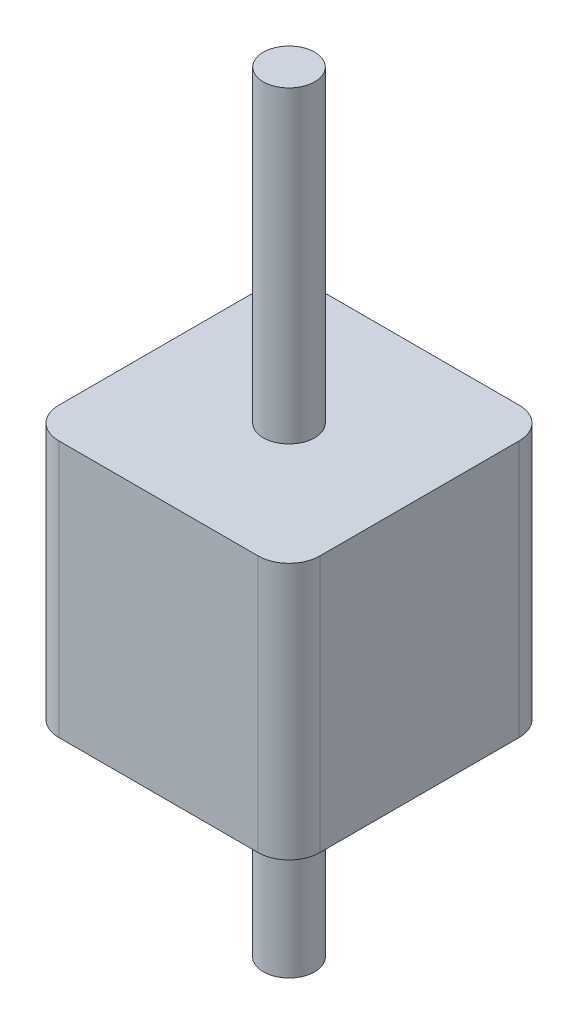
ISO-10303-21;
HEADER;
FILE_DESCRIPTION(('STEP AP214'),'2;1');
FILE_NAME('part.step','',(''),(''),'','','');
FILE_SCHEMA(('AUTOMOTIVE_DESIGN { 1 0 10303 214 1 1 1 1 }'));
ENDSEC;
DATA;
#1=APPLICATION_CONTEXT('core data for automotive mechanical design processes');
#2=APPLICATION_PROTOCOL_DEFINITION('international standard','automotive_design',2000,#1);
#3=PRODUCT_CONTEXT('',#1,'mechanical');
#4=PRODUCT('Part','Part','',(#3));
#5=PRODUCT_RELATED_PRODUCT_CATEGORY('part','',(#4));
#6=PRODUCT_DEFINITION_FORMATION('','',#4);
#7=PRODUCT_DEFINITION_CONTEXT('part definition',#1,'design');
#8=PRODUCT_DEFINITION('design','',#6,#7);
#9=PRODUCT_DEFINITION_SHAPE('','',#8);
#10=(LENGTH_UNIT() NAMED_UNIT(*) SI_UNIT(.MILLI.,.METRE.));
#11=(NAMED_UNIT(*) PLANE_ANGLE_UNIT() SI_UNIT($,.RADIAN.));
#12=(NAMED_UNIT(*) SI_UNIT($,.STERADIAN.) SOLID_ANGLE_UNIT());
#13=UNCERTAINTY_MEASURE_WITH_UNIT(LENGTH_MEASURE(1.E-05),#10,'distance_accuracy_value','');
#14=(GEOMETRIC_REPRESENTATION_CONTEXT(3) GLOBAL_UNCERTAINTY_ASSIGNED_CONTEXT((#13)) GLOBAL_UNIT_ASSIGNED_CONTEXT((#10,
#11,#12)) REPRESENTATION_CONTEXT('',''));
#15=CARTESIAN_POINT('',(0.,0.,0.));
#16=DIRECTION('',(0.,0.,1.));
#17=DIRECTION('',(1.,0.,0.));
#18=AXIS2_PLACEMENT_3D('',#15,#16,#17);
#19=CARTESIAN_POINT('',(0.97,2.5,0.97));
#20=DIRECTION('',(0.,-1.,0.));
#21=DIRECTION('',(0.,0.,-1.));
#22=AXIS2_PLACEMENT_3D('',#19,#20,#21);
#23=CYLINDRICAL_SURFACE('',#22,0.3);
#24=CARTESIAN_POINT('',(0.97,0.,0.97));
#25=DIRECTION('',(0.,1.,0.));
#26=DIRECTION('',(0.,0.,1.));
#27=AXIS2_PLACEMENT_3D('',#24,#25,#26);
#28=CIRCLE('',#27,0.3);
#29=CARTESIAN_POINT('',(0.969999999999998,0.,1.27));
#30=VERTEX_POINT('',#29);
#31=CARTESIAN_POINT('',(1.27,0.,0.969999999999998));
#32=VERTEX_POINT('',#31);
#33=EDGE_CURVE('E147',#30,#32,#28,.T.);
#34=ORIENTED_EDGE('',*,*,#33,.T.);
#35=DIRECTION('',(0.,-1.,0.));
#36=VECTOR('',#35,1.);
#37=CARTESIAN_POINT('',(1.27,2.5,0.969999999999998));
#38=LINE('',#37,#36);
#39=CARTESIAN_POINT('',(1.27,2.5,0.969999999999998));
#40=VERTEX_POINT('',#39);
#41=EDGE_CURVE('E54',#40,#32,#38,.T.);
#42=ORIENTED_EDGE('',*,*,#41,.F.);
#43=CARTESIAN_POINT('',(0.97,2.5,0.97));
#44=DIRECTION('',(0.,1.,0.));
#45=DIRECTION('',(0.,0.,1.));
#46=AXIS2_PLACEMENT_3D('',#43,#44,#45);
#47=CIRCLE('',#46,0.3);
#48=CARTESIAN_POINT('',(0.969999999999998,2.5,1.27));
#49=VERTEX_POINT('',#48);
#50=EDGE_CURVE('E170',#49,#40,#47,.T.);
#51=ORIENTED_EDGE('',*,*,#50,.F.);
#52=DIRECTION('',(0.,-1.,0.));
#53=VECTOR('',#52,1.);
#54=CARTESIAN_POINT('',(0.969999999999998,2.5,1.27));
#55=LINE('',#54,#53);
#56=EDGE_CURVE('E143',#49,#30,#55,.T.);
#57=ORIENTED_EDGE('',*,*,#56,.T.);
#58=EDGE_LOOP('',(#34,#42,#51,#57));
#59=FACE_BOUND('',#58,.T.);
#60=ADVANCED_FACE('F45',(#59),#23,.T.);
#61=CARTESIAN_POINT('',(1.27,2.5,0.969999999999998));
#62=DIRECTION('',(-1.,0.,0.));
#63=DIRECTION('',(0.,0.,1.));
#64=AXIS2_PLACEMENT_3D('',#61,#62,#63);
#65=PLANE('',#64);
#66=DIRECTION('',(0.,0.,-1.));
#67=VECTOR('',#66,1.);
#68=CARTESIAN_POINT('',(1.27,0.,0.969999999999998));
#69=LINE('',#68,#67);
#70=CARTESIAN_POINT('',(1.27,0.,-0.969999999999998));
#71=VERTEX_POINT('',#70);
#72=EDGE_CURVE('E151',#32,#71,#69,.T.);
#73=ORIENTED_EDGE('',*,*,#72,.T.);
#74=DIRECTION('',(0.,-1.,0.));
#75=VECTOR('',#74,1.);
#76=CARTESIAN_POINT('',(1.27,2.5,-0.969999999999998));
#77=LINE('',#76,#75);
#78=CARTESIAN_POINT('',(1.27,2.5,-0.969999999999998));
#79=VERTEX_POINT('',#78);
#80=EDGE_CURVE('E185',#79,#71,#77,.T.);
#81=ORIENTED_EDGE('',*,*,#80,.F.);
#82=DIRECTION('',(0.,0.,-1.));
#83=VECTOR('',#82,1.);
#84=CARTESIAN_POINT('',(1.27,2.5,0.969999999999998));
#85=LINE('',#84,#83);
#86=EDGE_CURVE('E106',#40,#79,#85,.T.);
#87=ORIENTED_EDGE('',*,*,#86,.F.);
#88=ORIENTED_EDGE('',*,*,#41,.T.);
#89=EDGE_LOOP('',(#73,#81,#87,#88));
#90=FACE_BOUND('',#89,.T.);
#91=ADVANCED_FACE('F190',(#90),#65,.F.);
#92=CARTESIAN_POINT('',(0.97,2.5,-0.97));
#93=DIRECTION('',(0.,-1.,0.));
#94=DIRECTION('',(0.,0.,-1.));
#95=AXIS2_PLACEMENT_3D('',#92,#93,#94);
#96=CYLINDRICAL_SURFACE('',#95,0.3);
#97=CARTESIAN_POINT('',(0.97,0.,-0.97));
#98=DIRECTION('',(0.,1.,0.));
#99=DIRECTION('',(0.,0.,-1.));
#100=AXIS2_PLACEMENT_3D('',#97,#98,#99);
#101=CIRCLE('',#100,0.3);
#102=CARTESIAN_POINT('',(0.969999999999998,0.,-1.27));
#103=VERTEX_POINT('',#102);
#104=EDGE_CURVE('E155',#71,#103,#101,.T.);
#105=ORIENTED_EDGE('',*,*,#104,.T.);
#106=DIRECTION('',(0.,-1.,0.));
#107=VECTOR('',#106,1.);
#108=CARTESIAN_POINT('',(0.969999999999998,2.5,-1.27));
#109=LINE('',#108,#107);
#110=CARTESIAN_POINT('',(0.969999999999998,2.5,-1.27));
#111=VERTEX_POINT('',#110);
#112=EDGE_CURVE('E181',#111,#103,#109,.T.);
#113=ORIENTED_EDGE('',*,*,#112,.F.);
#114=CARTESIAN_POINT('',(0.97,2.5,-0.97));
#115=DIRECTION('',(0.,1.,0.));
#116=DIRECTION('',(0.,0.,-1.));
#117=AXIS2_PLACEMENT_3D('',#114,#115,#116);
#118=CIRCLE('',#117,0.3);
#119=EDGE_CURVE('E209',#79,#111,#118,.T.);
#120=ORIENTED_EDGE('',*,*,#119,.F.);
#121=ORIENTED_EDGE('',*,*,#80,.T.);
#122=EDGE_LOOP('',(#105,#113,#120,#121));
#123=FACE_BOUND('',#122,.T.);
#124=ADVANCED_FACE('F201',(#123),#96,.T.);
#125=CARTESIAN_POINT('',(-0.969999999999998,2.5,-1.27));
#126=DIRECTION('',(0.,0.,1.));
#127=DIRECTION('',(1.,0.,0.));
#128=AXIS2_PLACEMENT_3D('',#125,#126,#127);
#129=PLANE('',#128);
#130=DIRECTION('',(-1.,0.,0.));
#131=VECTOR('',#130,1.);
#132=CARTESIAN_POINT('',(-0.969999999999998,0.,-1.27));
#133=LINE('',#132,#131);
#134=CARTESIAN_POINT('',(-0.97,0.,-1.27));
#135=VERTEX_POINT('',#134);
#136=EDGE_CURVE('E158',#103,#135,#133,.T.);
#137=ORIENTED_EDGE('',*,*,#136,.T.);
#138=DIRECTION('',(0.,-1.,0.));
#139=VECTOR('',#138,1.);
#140=CARTESIAN_POINT('',(-0.97,2.5,-1.27));
#141=LINE('',#140,#139);
#142=CARTESIAN_POINT('',(-0.97,2.5,-1.27));
#143=VERTEX_POINT('',#142);
#144=EDGE_CURVE('E177',#143,#135,#141,.T.);
#145=ORIENTED_EDGE('',*,*,#144,.F.);
#146=DIRECTION('',(-1.,0.,0.));
#147=VECTOR('',#146,1.);
#148=CARTESIAN_POINT('',(-0.969999999999998,2.5,-1.27));
#149=LINE('',#148,#147);
#150=EDGE_CURVE('E207',#111,#143,#149,.T.);
#151=ORIENTED_EDGE('',*,*,#150,.F.);
#152=ORIENTED_EDGE('',*,*,#112,.T.);
#153=EDGE_LOOP('',(#137,#145,#151,#152));
#154=FACE_BOUND('',#153,.T.);
#155=ADVANCED_FACE('F205',(#154),#129,.F.);
#156=CARTESIAN_POINT('',(-0.97,2.5,-0.97));
#157=DIRECTION('',(0.,-1.,0.));
#158=DIRECTION('',(0.,0.,-1.));
#159=AXIS2_PLACEMENT_3D('',#156,#157,#158);
#160=CYLINDRICAL_SURFACE('',#159,0.3);
#161=CARTESIAN_POINT('',(-0.97,0.,-0.97));
#162=DIRECTION('',(0.,1.,0.));
#163=DIRECTION('',(0.,0.,-1.));
#164=AXIS2_PLACEMENT_3D('',#161,#162,#163);
#165=CIRCLE('',#164,0.3);
#166=CARTESIAN_POINT('',(-1.27,0.,-0.969999999999998));
#167=VERTEX_POINT('',#166);
#168=EDGE_CURVE('E161',#135,#167,#165,.T.);
#169=ORIENTED_EDGE('',*,*,#168,.T.);
#170=DIRECTION('',(0.,-1.,0.));
#171=VECTOR('',#170,1.);
#172=CARTESIAN_POINT('',(-1.27,2.5,-0.969999999999998));
#173=LINE('',#172,#171);
#174=CARTESIAN_POINT('',(-1.27,2.5,-0.969999999999998));
#175=VERTEX_POINT('',#174);
#176=EDGE_CURVE('E136',#175,#167,#173,.T.);
#177=ORIENTED_EDGE('',*,*,#176,.F.);
#178=CARTESIAN_POINT('',(-0.97,2.5,-0.97));
#179=DIRECTION('',(0.,1.,0.));
#180=DIRECTION('',(0.,0.,-1.));
#181=AXIS2_PLACEMENT_3D('',#178,#179,#180);
#182=CIRCLE('',#181,0.3);
#183=EDGE_CURVE('E125',#143,#175,#182,.T.);
#184=ORIENTED_EDGE('',*,*,#183,.F.);
#185=ORIENTED_EDGE('',*,*,#144,.T.);
#186=EDGE_LOOP('',(#169,#177,#184,#185));
#187=FACE_BOUND('',#186,.T.);
#188=ADVANCED_FACE('F264',(#187),#160,.T.);
#189=CARTESIAN_POINT('',(-1.27,2.5,0.969999999999998));
#190=DIRECTION('',(1.,0.,0.));
#191=DIRECTION('',(0.,0.,-1.));
#192=AXIS2_PLACEMENT_3D('',#189,#190,#191);
#193=PLANE('',#192);
#194=DIRECTION('',(0.,0.,1.));
#195=VECTOR('',#194,1.);
#196=CARTESIAN_POINT('',(-1.27,0.,0.969999999999998));
#197=LINE('',#196,#195);
#198=CARTESIAN_POINT('',(-1.27,0.,0.969999999999998));
#199=VERTEX_POINT('',#198);
#200=EDGE_CURVE('E134',#167,#199,#197,.T.);
#201=ORIENTED_EDGE('',*,*,#200,.T.);
#202=DIRECTION('',(0.,-1.,0.));
#203=VECTOR('',#202,1.);
#204=CARTESIAN_POINT('',(-1.27,2.5,0.969999999999998));
#205=LINE('',#204,#203);
#206=CARTESIAN_POINT('',(-1.27,2.5,0.969999999999998));
#207=VERTEX_POINT('',#206);
#208=EDGE_CURVE('E131',#207,#199,#205,.T.);
#209=ORIENTED_EDGE('',*,*,#208,.F.);
#210=DIRECTION('',(0.,0.,1.));
#211=VECTOR('',#210,1.);
#212=CARTESIAN_POINT('',(-1.27,2.5,0.969999999999998));
#213=LINE('',#212,#211);
#214=EDGE_CURVE('E119',#175,#207,#213,.T.);
#215=ORIENTED_EDGE('',*,*,#214,.F.);
#216=ORIENTED_EDGE('',*,*,#176,.T.);
#217=EDGE_LOOP('',(#201,#209,#215,#216));
#218=FACE_BOUND('',#217,.T.);
#219=ADVANCED_FACE('F132',(#218),#193,.F.);
#220=CARTESIAN_POINT('',(-0.97,2.5,0.97));
#221=DIRECTION('',(0.,-1.,0.));
#222=DIRECTION('',(0.,0.,-1.));
#223=AXIS2_PLACEMENT_3D('',#220,#221,#222);
#224=CYLINDRICAL_SURFACE('',#223,0.3);
#225=CARTESIAN_POINT('',(-0.97,0.,0.97));
#226=DIRECTION('',(0.,1.,0.));
#227=DIRECTION('',(0.,0.,-1.));
#228=AXIS2_PLACEMENT_3D('',#225,#226,#227);
#229=CIRCLE('',#228,0.3);
#230=CARTESIAN_POINT('',(-0.969999999999998,0.,1.27));
#231=VERTEX_POINT('',#230);
#232=EDGE_CURVE('E91',#199,#231,#229,.T.);
#233=ORIENTED_EDGE('',*,*,#232,.T.);
#234=DIRECTION('',(0.,-1.,0.));
#235=VECTOR('',#234,1.);
#236=CARTESIAN_POINT('',(-0.969999999999998,2.5,1.27));
#237=LINE('',#236,#235);
#238=CARTESIAN_POINT('',(-0.969999999999998,2.5,1.27));
#239=VERTEX_POINT('',#238);
#240=EDGE_CURVE('E137',#239,#231,#237,.T.);
#241=ORIENTED_EDGE('',*,*,#240,.F.);
#242=CARTESIAN_POINT('',(-0.97,2.5,0.97));
#243=DIRECTION('',(0.,1.,0.));
#244=DIRECTION('',(0.,0.,-1.));
#245=AXIS2_PLACEMENT_3D('',#242,#243,#244);
#246=CIRCLE('',#245,0.3);
#247=EDGE_CURVE('E123',#207,#239,#246,.T.);
#248=ORIENTED_EDGE('',*,*,#247,.F.);
#249=ORIENTED_EDGE('',*,*,#208,.T.);
#250=EDGE_LOOP('',(#233,#241,#248,#249));
#251=FACE_BOUND('',#250,.T.);
#252=ADVANCED_FACE('F139',(#251),#224,.T.);
#253=CARTESIAN_POINT('',(-0.969999999999998,2.5,1.27));
#254=DIRECTION('',(0.,0.,-1.));
#255=DIRECTION('',(-1.,0.,0.));
#256=AXIS2_PLACEMENT_3D('',#253,#254,#255);
#257=PLANE('',#256);
#258=DIRECTION('',(1.,0.,0.));
#259=VECTOR('',#258,1.);
#260=CARTESIAN_POINT('',(-0.969999999999998,0.,1.27));
#261=LINE('',#260,#259);
#262=EDGE_CURVE('E97',#231,#30,#261,.T.);
#263=ORIENTED_EDGE('',*,*,#262,.T.);
#264=ORIENTED_EDGE('',*,*,#56,.F.);
#265=DIRECTION('',(1.,0.,0.));
#266=VECTOR('',#265,1.);
#267=CARTESIAN_POINT('',(-0.969999999999998,2.5,1.27));
#268=LINE('',#267,#266);
#269=EDGE_CURVE('E62',#239,#49,#268,.T.);
#270=ORIENTED_EDGE('',*,*,#269,.F.);
#271=ORIENTED_EDGE('',*,*,#240,.T.);
#272=EDGE_LOOP('',(#263,#264,#270,#271));
#273=FACE_BOUND('',#272,.T.);
#274=ADVANCED_FACE('F249',(#273),#257,.F.);
#275=CARTESIAN_POINT('',(0.97,2.5,0.97));
#276=DIRECTION('',(0.,1.,0.));
#277=DIRECTION('',(0.,0.,1.));
#278=AXIS2_PLACEMENT_3D('',#275,#276,#277);
#279=PLANE('',#278);
#280=CARTESIAN_POINT('',(0.,2.5,0.));
#281=DIRECTION('',(0.,1.,0.));
#282=DIRECTION('',(0.,0.,1.));
#283=AXIS2_PLACEMENT_3D('',#280,#281,#282);
#284=CIRCLE('',#283,0.25);
#285=CARTESIAN_POINT('',(0.,2.5,0.25));
#286=VERTEX_POINT('',#285);
#287=EDGE_CURVE('E219',#286,#286,#284,.T.);
#288=ORIENTED_EDGE('',*,*,#287,.F.);
#289=EDGE_LOOP('',(#288));
#290=FACE_BOUND('',#289,.T.);
#291=ORIENTED_EDGE('',*,*,#50,.T.);
#292=ORIENTED_EDGE('',*,*,#86,.T.);
#293=ORIENTED_EDGE('',*,*,#119,.T.);
#294=ORIENTED_EDGE('',*,*,#150,.T.);
#295=ORIENTED_EDGE('',*,*,#183,.T.);
#296=ORIENTED_EDGE('',*,*,#214,.T.);
#297=ORIENTED_EDGE('',*,*,#247,.T.);
#298=ORIENTED_EDGE('',*,*,#269,.T.);
#299=EDGE_LOOP('',(#291,#292,#293,#294,#295,#296,#297,#298));
#300=FACE_BOUND('',#299,.T.);
#301=ADVANCED_FACE('F121',(#290,#300),#279,.T.);
#302=CARTESIAN_POINT('',(0.97,0.,0.97));
#303=DIRECTION('',(0.,1.,0.));
#304=DIRECTION('',(0.,0.,1.));
#305=AXIS2_PLACEMENT_3D('',#302,#303,#304);
#306=PLANE('',#305);
#307=CARTESIAN_POINT('',(0.,0.,0.));
#308=DIRECTION('',(0.,1.,0.));
#309=DIRECTION('',(0.,0.,1.));
#310=AXIS2_PLACEMENT_3D('',#307,#308,#309);
#311=CIRCLE('',#310,0.25);
#312=CARTESIAN_POINT('',(0.,0.,0.25));
#313=VERTEX_POINT('',#312);
#314=EDGE_CURVE('E11',#313,#313,#311,.F.);
#315=ORIENTED_EDGE('',*,*,#314,.F.);
#316=EDGE_LOOP('',(#315));
#317=FACE_BOUND('',#316,.T.);
#318=ORIENTED_EDGE('',*,*,#33,.F.);
#319=ORIENTED_EDGE('',*,*,#262,.F.);
#320=ORIENTED_EDGE('',*,*,#232,.F.);
#321=ORIENTED_EDGE('',*,*,#200,.F.);
#322=ORIENTED_EDGE('',*,*,#168,.F.);
#323=ORIENTED_EDGE('',*,*,#136,.F.);
#324=ORIENTED_EDGE('',*,*,#104,.F.);
#325=ORIENTED_EDGE('',*,*,#72,.F.);
#326=EDGE_LOOP('',(#318,#319,#320,#321,#322,#323,#324,#325));
#327=FACE_BOUND('',#326,.T.);
#328=ADVANCED_FACE('F195',(#317,#327),#306,.F.);
#329=CARTESIAN_POINT('',(0.,5.5,0.));
#330=DIRECTION('',(0.,-1.,0.));
#331=DIRECTION('',(0.,0.,-1.));
#332=AXIS2_PLACEMENT_3D('',#329,#330,#331);
#333=CYLINDRICAL_SURFACE('',#332,0.25);
#334=CARTESIAN_POINT('',(0.,5.5,0.));
#335=DIRECTION('',(0.,1.,0.));
#336=DIRECTION('',(0.,0.,1.));
#337=AXIS2_PLACEMENT_3D('',#334,#335,#336);
#338=CIRCLE('',#337,0.25);
#339=CARTESIAN_POINT('',(0.,5.5,0.25));
#340=VERTEX_POINT('',#339);
#341=EDGE_CURVE('E152',#340,#340,#338,.T.);
#342=ORIENTED_EDGE('',*,*,#341,.F.);
#343=EDGE_LOOP('',(#342));
#344=FACE_BOUND('',#343,.T.);
#345=ORIENTED_EDGE('',*,*,#287,.T.);
#346=EDGE_LOOP('',(#345));
#347=FACE_BOUND('',#346,.T.);
#348=ADVANCED_FACE('F241',(#344,#347),#333,.T.);
#349=CARTESIAN_POINT('',(0.,5.5,0.));
#350=DIRECTION('',(0.,1.,0.));
#351=DIRECTION('',(0.,0.,1.));
#352=AXIS2_PLACEMENT_3D('',#349,#350,#351);
#353=PLANE('',#352);
#354=ORIENTED_EDGE('',*,*,#341,.T.);
#355=EDGE_LOOP('',(#354));
#356=FACE_BOUND('',#355,.T.);
#357=ADVANCED_FACE('F236',(#356),#353,.T.);
#358=CARTESIAN_POINT('',(0.,-2.,0.));
#359=DIRECTION('',(0.,1.,0.));
#360=DIRECTION('',(0.,0.,1.));
#361=AXIS2_PLACEMENT_3D('',#358,#359,#360);
#362=CYLINDRICAL_SURFACE('',#361,0.25);
#363=CARTESIAN_POINT('',(0.,-2.,0.));
#364=DIRECTION('',(0.,-1.,0.));
#365=DIRECTION('',(0.,0.,-1.));
#366=AXIS2_PLACEMENT_3D('',#363,#364,#365);
#367=CIRCLE('',#366,0.25);
#368=CARTESIAN_POINT('',(0.,-2.,-0.25));
#369=VERTEX_POINT('',#368);
#370=EDGE_CURVE('E223',#369,#369,#367,.T.);
#371=ORIENTED_EDGE('',*,*,#370,.F.);
#372=EDGE_LOOP('',(#371));
#373=FACE_BOUND('',#372,.T.);
#374=ORIENTED_EDGE('',*,*,#314,.T.);
#375=EDGE_LOOP('',(#374));
#376=FACE_BOUND('',#375,.T.);
#377=ADVANCED_FACE('F233',(#373,#376),#362,.T.);
#378=CARTESIAN_POINT('',(0.,-2.,0.));
#379=DIRECTION('',(0.,-1.,0.));
#380=DIRECTION('',(0.,0.,-1.));
#381=AXIS2_PLACEMENT_3D('',#378,#379,#380);
#382=PLANE('',#381);
#383=ORIENTED_EDGE('',*,*,#370,.T.);
#384=EDGE_LOOP('',(#383));
#385=FACE_BOUND('',#384,.T.);
#386=ADVANCED_FACE('F231',(#385),#382,.T.);
#387=CLOSED_SHELL('',(#60,#91,#124,#155,#188,#219,#252,#274,#301,#328,#348,#357,#377,#386));
#388=MANIFOLD_SOLID_BREP('B2',#387);
#389=ADVANCED_BREP_SHAPE_REPRESENTATION('',(#18,#388),#14);
#390=SHAPE_DEFINITION_REPRESENTATION(#9,#389);
ENDSEC;
END-ISO-10303-21;
